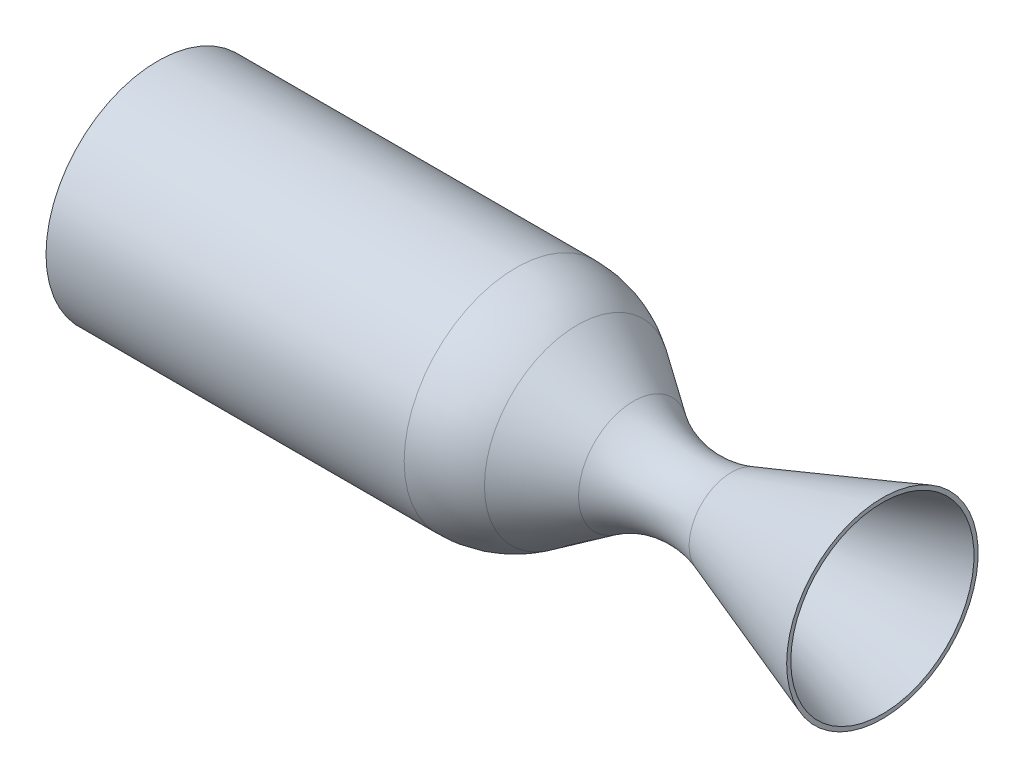
ISO-10303-21;
HEADER;
FILE_DESCRIPTION(('STEP AP214'),'2;1');
FILE_NAME('part.step','',(''),(''),'','','');
FILE_SCHEMA(('AUTOMOTIVE_DESIGN { 1 0 10303 214 1 1 1 1 }'));
ENDSEC;
DATA;
#1=APPLICATION_CONTEXT('core data for automotive mechanical design processes');
#2=APPLICATION_PROTOCOL_DEFINITION('international standard','automotive_design',2000,#1);
#3=PRODUCT_CONTEXT('',#1,'mechanical');
#4=PRODUCT('Part','Part','',(#3));
#5=PRODUCT_RELATED_PRODUCT_CATEGORY('part','',(#4));
#6=PRODUCT_DEFINITION_FORMATION('','',#4);
#7=PRODUCT_DEFINITION_CONTEXT('part definition',#1,'design');
#8=PRODUCT_DEFINITION('design','',#6,#7);
#9=PRODUCT_DEFINITION_SHAPE('','',#8);
#10=(LENGTH_UNIT() NAMED_UNIT(*) SI_UNIT(.MILLI.,.METRE.));
#11=(NAMED_UNIT(*) PLANE_ANGLE_UNIT() SI_UNIT($,.RADIAN.));
#12=(NAMED_UNIT(*) SI_UNIT($,.STERADIAN.) SOLID_ANGLE_UNIT());
#13=UNCERTAINTY_MEASURE_WITH_UNIT(LENGTH_MEASURE(1.E-05),#10,'distance_accuracy_value','');
#14=(GEOMETRIC_REPRESENTATION_CONTEXT(3) GLOBAL_UNCERTAINTY_ASSIGNED_CONTEXT((#13)) GLOBAL_UNIT_ASSIGNED_CONTEXT((#10,
#11,#12)) REPRESENTATION_CONTEXT('',''));
#15=CARTESIAN_POINT('',(0.,0.,0.));
#16=DIRECTION('',(0.,0.,1.));
#17=DIRECTION('',(1.,0.,0.));
#18=AXIS2_PLACEMENT_3D('',#15,#16,#17);
#19=CARTESIAN_POINT('',(0.,0.,0.));
#20=DIRECTION('',(1.,0.,0.));
#21=DIRECTION('',(0.,0.,-1.));
#22=AXIS2_PLACEMENT_3D('',#19,#20,#21);
#23=PLANE('',#22);
#24=CARTESIAN_POINT('',(0.,-57.,0.));
#25=DIRECTION('',(-1.,0.,0.));
#26=DIRECTION('',(0.,0.,1.));
#27=AXIS2_PLACEMENT_3D('',#24,#25,#26);
#28=CIRCLE('',#27,55.);
#29=CARTESIAN_POINT('',(0.,-57.,55.));
#30=VERTEX_POINT('',#29);
#31=EDGE_CURVE('E81',#30,#30,#28,.T.);
#32=ORIENTED_EDGE('',*,*,#31,.F.);
#33=EDGE_LOOP('',(#32));
#34=FACE_BOUND('',#33,.T.);
#35=CARTESIAN_POINT('',(0.,-57.,0.));
#36=DIRECTION('',(-1.,0.,0.));
#37=DIRECTION('',(0.,0.,1.));
#38=AXIS2_PLACEMENT_3D('',#35,#36,#37);
#39=CIRCLE('',#38,57.);
#40=CARTESIAN_POINT('',(0.,-57.,57.));
#41=VERTEX_POINT('',#40);
#42=EDGE_CURVE('E10',#41,#41,#39,.T.);
#43=ORIENTED_EDGE('',*,*,#42,.T.);
#44=EDGE_LOOP('',(#43));
#45=FACE_BOUND('',#44,.T.);
#46=ADVANCED_FACE('F41',(#34,#45),#23,.F.);
#47=CARTESIAN_POINT('',(0.,-57.,0.));
#48=DIRECTION('',(-1.,0.,0.));
#49=DIRECTION('',(0.,0.,1.));
#50=AXIS2_PLACEMENT_3D('',#47,#48,#49);
#51=CYLINDRICAL_SURFACE('',#50,57.);
#52=ORIENTED_EDGE('',*,*,#42,.F.);
#53=EDGE_LOOP('',(#52));
#54=FACE_BOUND('',#53,.T.);
#55=CARTESIAN_POINT('',(182.844096166921,-57.,0.));
#56=DIRECTION('',(-1.,0.,0.));
#57=DIRECTION('',(0.,0.,1.));
#58=AXIS2_PLACEMENT_3D('',#55,#56,#57);
#59=CIRCLE('',#58,57.);
#60=CARTESIAN_POINT('',(182.844096166921,-57.,57.));
#61=VERTEX_POINT('',#60);
#62=EDGE_CURVE('E47',#61,#61,#59,.T.);
#63=ORIENTED_EDGE('',*,*,#62,.T.);
#64=EDGE_LOOP('',(#63));
#65=FACE_BOUND('',#64,.T.);
#66=ADVANCED_FACE('F88',(#54,#65),#51,.T.);
#67=CARTESIAN_POINT('',(182.844096166921,-57.,0.));
#68=DIRECTION('',(-1.,0.,0.));
#69=DIRECTION('',(0.,0.,1.));
#70=AXIS2_PLACEMENT_3D('',#67,#68,#69);
#71=DEGENERATE_TOROIDAL_SURFACE('',#70,1.00000000000001,56.,.T.);
#72=ORIENTED_EDGE('',*,*,#62,.F.);
#73=EDGE_LOOP('',(#72));
#74=FACE_BOUND('',#73,.T.);
#75=CARTESIAN_POINT('',(214.211919245342,-57.,0.));
#76=DIRECTION('',(-1.,0.,0.));
#77=DIRECTION('',(0.,0.,1.));
#78=AXIS2_PLACEMENT_3D('',#75,#76,#77);
#79=CIRCLE('',#78,47.3902972109571);
#80=CARTESIAN_POINT('',(214.211919245342,-57.,47.3902972109571));
#81=VERTEX_POINT('',#80);
#82=EDGE_CURVE('E51',#81,#81,#79,.T.);
#83=ORIENTED_EDGE('',*,*,#82,.T.);
#84=EDGE_LOOP('',(#83));
#85=FACE_BOUND('',#84,.T.);
#86=ADVANCED_FACE('F92',(#74,#85),#71,.T.);
#87=CARTESIAN_POINT('',(242.861384298336,-57.,0.));
#88=DIRECTION('',(-1.,0.,0.));
#89=DIRECTION('',(0.,0.,1.));
#90=AXIS2_PLACEMENT_3D('',#87,#88,#89);
#91=CONICAL_SURFACE('',#90,28.0183292542305,0.594554426480239);
#92=ORIENTED_EDGE('',*,*,#82,.F.);
#93=EDGE_LOOP('',(#92));
#94=FACE_BOUND('',#93,.T.);
#95=CARTESIAN_POINT('',(242.861384298336,-57.,0.));
#96=DIRECTION('',(-1.,0.,0.));
#97=DIRECTION('',(0.,0.,1.));
#98=AXIS2_PLACEMENT_3D('',#95,#96,#97);
#99=CIRCLE('',#98,28.0183292542305);
#100=CARTESIAN_POINT('',(242.861384298336,-57.,28.0183292542305));
#101=VERTEX_POINT('',#100);
#102=EDGE_CURVE('E55',#101,#101,#99,.T.);
#103=ORIENTED_EDGE('',*,*,#102,.T.);
#104=EDGE_LOOP('',(#103));
#105=FACE_BOUND('',#104,.T.);
#106=ADVANCED_FACE('F97',(#94,#105),#91,.T.);
#107=CARTESIAN_POINT('',(274.229207376756,-57.,0.));
#108=DIRECTION('',(-1.,0.,0.));
#109=DIRECTION('',(0.,0.,1.));
#110=AXIS2_PLACEMENT_3D('',#107,#108,#109);
#111=TOROIDAL_SURFACE('',#110,74.4086264651876,56.);
#112=ORIENTED_EDGE('',*,*,#102,.F.);
#113=EDGE_LOOP('',(#112));
#114=FACE_BOUND('',#113,.T.);
#115=CARTESIAN_POINT('',(292.912582145206,-57.,0.));
#116=DIRECTION('',(-1.,0.,0.));
#117=DIRECTION('',(0.,0.,1.));
#118=AXIS2_PLACEMENT_3D('',#115,#116,#117);
#119=CIRCLE('',#118,21.6172303171254);
#120=CARTESIAN_POINT('',(292.912582145206,-57.,21.6172303171254));
#121=VERTEX_POINT('',#120);
#122=EDGE_CURVE('E60',#121,#121,#119,.T.);
#123=ORIENTED_EDGE('',*,*,#122,.T.);
#124=EDGE_LOOP('',(#123));
#125=FACE_BOUND('',#124,.T.);
#126=ADVANCED_FACE('F103',(#114,#125),#111,.F.);
#127=CARTESIAN_POINT('',(369.969238449347,-57.,0.));
#128=DIRECTION('',(1.,0.,0.));
#129=DIRECTION('',(0.,0.,-1.));
#130=AXIS2_PLACEMENT_3D('',#127,#128,#129);
#131=CONICAL_SURFACE('',#130,48.8883103259984,0.340153384630955);
#132=ORIENTED_EDGE('',*,*,#122,.F.);
#133=EDGE_LOOP('',(#132));
#134=FACE_BOUND('',#133,.T.);
#135=CARTESIAN_POINT('',(369.969238449347,-57.,0.));
#136=DIRECTION('',(-1.,0.,0.));
#137=DIRECTION('',(0.,0.,1.));
#138=AXIS2_PLACEMENT_3D('',#135,#136,#137);
#139=CIRCLE('',#138,48.8883103259984);
#140=CARTESIAN_POINT('',(369.969238449347,-57.,48.8883103259984));
#141=VERTEX_POINT('',#140);
#142=EDGE_CURVE('E63',#141,#141,#139,.T.);
#143=ORIENTED_EDGE('',*,*,#142,.T.);
#144=EDGE_LOOP('',(#143));
#145=FACE_BOUND('',#144,.T.);
#146=ADVANCED_FACE('F107',(#134,#145),#131,.T.);
#147=CARTESIAN_POINT('',(369.969238449347,-8.11168967400157,0.));
#148=DIRECTION('',(-1.,0.,0.));
#149=DIRECTION('',(0.,0.,1.));
#150=AXIS2_PLACEMENT_3D('',#147,#148,#149);
#151=PLANE('',#150);
#152=ORIENTED_EDGE('',*,*,#142,.F.);
#153=EDGE_LOOP('',(#152));
#154=FACE_BOUND('',#153,.T.);
#155=CARTESIAN_POINT('',(369.969238449347,-57.,0.));
#156=DIRECTION('',(-1.,0.,0.));
#157=DIRECTION('',(0.,0.,1.));
#158=AXIS2_PLACEMENT_3D('',#155,#156,#157);
#159=CIRCLE('',#158,46.7667524932433);
#160=CARTESIAN_POINT('',(369.969238449347,-57.,46.7667524932433));
#161=VERTEX_POINT('',#160);
#162=EDGE_CURVE('E66',#161,#161,#159,.T.);
#163=ORIENTED_EDGE('',*,*,#162,.T.);
#164=EDGE_LOOP('',(#163));
#165=FACE_BOUND('',#164,.T.);
#166=ADVANCED_FACE('F111',(#154,#165),#151,.F.);
#167=CARTESIAN_POINT('',(293.579845529793,-57.,0.));
#168=DIRECTION('',(1.,0.,0.));
#169=DIRECTION('',(0.,0.,-1.));
#170=AXIS2_PLACEMENT_3D('',#167,#168,#169);
#171=CONICAL_SURFACE('',#170,19.7318233118375,0.340153384630955);
#172=ORIENTED_EDGE('',*,*,#162,.F.);
#173=EDGE_LOOP('',(#172));
#174=FACE_BOUND('',#173,.T.);
#175=CARTESIAN_POINT('',(293.579845529793,-57.,0.));
#176=DIRECTION('',(-1.,0.,0.));
#177=DIRECTION('',(0.,0.,1.));
#178=AXIS2_PLACEMENT_3D('',#175,#176,#177);
#179=CIRCLE('',#178,19.7318233118375);
#180=CARTESIAN_POINT('',(293.579845529793,-57.,19.7318233118375));
#181=VERTEX_POINT('',#180);
#182=EDGE_CURVE('E69',#181,#181,#179,.T.);
#183=ORIENTED_EDGE('',*,*,#182,.T.);
#184=EDGE_LOOP('',(#183));
#185=FACE_BOUND('',#184,.T.);
#186=ADVANCED_FACE('F115',(#174,#185),#171,.F.);
#187=CARTESIAN_POINT('',(274.229207376756,-57.,0.));
#188=DIRECTION('',(-1.,0.,0.));
#189=DIRECTION('',(0.,0.,1.));
#190=AXIS2_PLACEMENT_3D('',#187,#188,#189);
#191=TOROIDAL_SURFACE('',#190,74.4086264651876,58.);
#192=ORIENTED_EDGE('',*,*,#182,.F.);
#193=EDGE_LOOP('',(#192));
#194=FACE_BOUND('',#193,.T.);
#195=CARTESIAN_POINT('',(241.741104902678,-57.,0.));
#196=DIRECTION('',(-1.,0.,0.));
#197=DIRECTION('',(0.,0.,1.));
#198=AXIS2_PLACEMENT_3D('',#195,#196,#197);
#199=CIRCLE('',#198,26.3615329252677);
#200=CARTESIAN_POINT('',(241.741104902678,-57.,26.3615329252677));
#201=VERTEX_POINT('',#200);
#202=EDGE_CURVE('E72',#201,#201,#199,.T.);
#203=ORIENTED_EDGE('',*,*,#202,.T.);
#204=EDGE_LOOP('',(#203));
#205=FACE_BOUND('',#204,.T.);
#206=ADVANCED_FACE('F119',(#194,#205),#191,.T.);
#207=CARTESIAN_POINT('',(213.091639849684,-57.,0.));
#208=DIRECTION('',(-1.,0.,0.));
#209=DIRECTION('',(0.,0.,1.));
#210=AXIS2_PLACEMENT_3D('',#207,#208,#209);
#211=CONICAL_SURFACE('',#210,45.7335008819944,0.594554426480239);
#212=ORIENTED_EDGE('',*,*,#202,.F.);
#213=EDGE_LOOP('',(#212));
#214=FACE_BOUND('',#213,.T.);
#215=CARTESIAN_POINT('',(213.091639849684,-57.,0.));
#216=DIRECTION('',(-1.,0.,0.));
#217=DIRECTION('',(0.,0.,1.));
#218=AXIS2_PLACEMENT_3D('',#215,#216,#217);
#219=CIRCLE('',#218,45.7335008819944);
#220=CARTESIAN_POINT('',(213.091639849684,-57.,45.7335008819944));
#221=VERTEX_POINT('',#220);
#222=EDGE_CURVE('E75',#221,#221,#219,.T.);
#223=ORIENTED_EDGE('',*,*,#222,.T.);
#224=EDGE_LOOP('',(#223));
#225=FACE_BOUND('',#224,.T.);
#226=ADVANCED_FACE('F123',(#214,#225),#211,.F.);
#227=CARTESIAN_POINT('',(182.844096166921,-57.,0.));
#228=DIRECTION('',(-1.,0.,0.));
#229=DIRECTION('',(0.,0.,1.));
#230=AXIS2_PLACEMENT_3D('',#227,#228,#229);
#231=DEGENERATE_TOROIDAL_SURFACE('',#230,1.00000000000001,54.,.T.);
#232=ORIENTED_EDGE('',*,*,#222,.F.);
#233=EDGE_LOOP('',(#232));
#234=FACE_BOUND('',#233,.T.);
#235=CARTESIAN_POINT('',(182.844096166921,-57.,0.));
#236=DIRECTION('',(-1.,0.,0.));
#237=DIRECTION('',(0.,0.,1.));
#238=AXIS2_PLACEMENT_3D('',#235,#236,#237);
#239=CIRCLE('',#238,55.);
#240=CARTESIAN_POINT('',(182.844096166921,-57.,55.));
#241=VERTEX_POINT('',#240);
#242=EDGE_CURVE('E78',#241,#241,#239,.T.);
#243=ORIENTED_EDGE('',*,*,#242,.T.);
#244=EDGE_LOOP('',(#243));
#245=FACE_BOUND('',#244,.T.);
#246=ADVANCED_FACE('F127',(#234,#245),#231,.F.);
#247=CARTESIAN_POINT('',(0.,-57.,0.));
#248=DIRECTION('',(-1.,0.,0.));
#249=DIRECTION('',(0.,0.,1.));
#250=AXIS2_PLACEMENT_3D('',#247,#248,#249);
#251=CYLINDRICAL_SURFACE('',#250,55.);
#252=ORIENTED_EDGE('',*,*,#242,.F.);
#253=EDGE_LOOP('',(#252));
#254=FACE_BOUND('',#253,.T.);
#255=ORIENTED_EDGE('',*,*,#31,.T.);
#256=EDGE_LOOP('',(#255));
#257=FACE_BOUND('',#256,.T.);
#258=ADVANCED_FACE('F85',(#254,#257),#251,.F.);
#259=CLOSED_SHELL('',(#46,#66,#86,#106,#126,#146,#166,#186,#206,#226,#246,#258));
#260=MANIFOLD_SOLID_BREP('B2',#259);
#261=ADVANCED_BREP_SHAPE_REPRESENTATION('',(#18,#260),#14);
#262=SHAPE_DEFINITION_REPRESENTATION(#9,#261);
ENDSEC;
END-ISO-10303-21;
